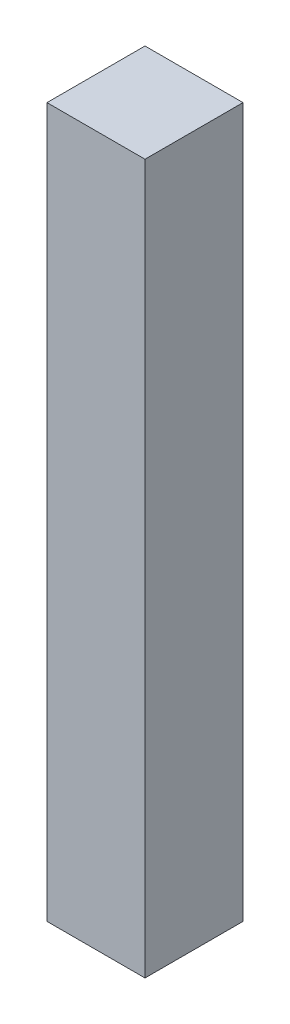
ISO-10303-21;
HEADER;
FILE_DESCRIPTION(('STEP AP214'),'2;1');
FILE_NAME('part.step','',(''),(''),'','','');
FILE_SCHEMA(('AUTOMOTIVE_DESIGN { 1 0 10303 214 1 1 1 1 }'));
ENDSEC;
DATA;
#1=APPLICATION_CONTEXT('core data for automotive mechanical design processes');
#2=APPLICATION_PROTOCOL_DEFINITION('international standard','automotive_design',2000,#1);
#3=PRODUCT_CONTEXT('',#1,'mechanical');
#4=PRODUCT('Part','Part','',(#3));
#5=PRODUCT_RELATED_PRODUCT_CATEGORY('part','',(#4));
#6=PRODUCT_DEFINITION_FORMATION('','',#4);
#7=PRODUCT_DEFINITION_CONTEXT('part definition',#1,'design');
#8=PRODUCT_DEFINITION('design','',#6,#7);
#9=PRODUCT_DEFINITION_SHAPE('','',#8);
#10=(LENGTH_UNIT() NAMED_UNIT(*) SI_UNIT(.MILLI.,.METRE.));
#11=(NAMED_UNIT(*) PLANE_ANGLE_UNIT() SI_UNIT($,.RADIAN.));
#12=(NAMED_UNIT(*) SI_UNIT($,.STERADIAN.) SOLID_ANGLE_UNIT());
#13=UNCERTAINTY_MEASURE_WITH_UNIT(LENGTH_MEASURE(1.E-05),#10,'distance_accuracy_value','');
#14=(GEOMETRIC_REPRESENTATION_CONTEXT(3) GLOBAL_UNCERTAINTY_ASSIGNED_CONTEXT((#13)) GLOBAL_UNIT_ASSIGNED_CONTEXT((#10,
#11,#12)) REPRESENTATION_CONTEXT('',''));
#15=CARTESIAN_POINT('',(0.,0.,0.));
#16=DIRECTION('',(0.,0.,1.));
#17=DIRECTION('',(1.,0.,0.));
#18=AXIS2_PLACEMENT_3D('',#15,#16,#17);
#19=CARTESIAN_POINT('',(-36.0550458715596,217.,-5.27064220183486));
#20=DIRECTION('',(1.,0.,0.));
#21=DIRECTION('',(0.,0.,-1.));
#22=AXIS2_PLACEMENT_3D('',#19,#20,#21);
#23=PLANE('',#22);
#24=DIRECTION('',(0.,0.,1.));
#25=VECTOR('',#24,1.);
#26=CARTESIAN_POINT('',(-36.0550458715596,0.,-5.27064220183486));
#27=LINE('',#26,#25);
#28=CARTESIAN_POINT('',(-36.0550458715596,0.,-5.27064220183486));
#29=VERTEX_POINT('',#28);
#30=CARTESIAN_POINT('',(-36.0550458715596,0.,24.7293577981651));
#31=VERTEX_POINT('',#30);
#32=EDGE_CURVE('E100',#29,#31,#27,.T.);
#33=ORIENTED_EDGE('',*,*,#32,.T.);
#34=DIRECTION('',(0.,-1.,0.));
#35=VECTOR('',#34,1.);
#36=CARTESIAN_POINT('',(-36.0550458715596,217.,24.7293577981651));
#37=LINE('',#36,#35);
#38=CARTESIAN_POINT('',(-36.0550458715596,217.,24.7293577981651));
#39=VERTEX_POINT('',#38);
#40=EDGE_CURVE('E11',#39,#31,#37,.T.);
#41=ORIENTED_EDGE('',*,*,#40,.F.);
#42=DIRECTION('',(0.,0.,1.));
#43=VECTOR('',#42,1.);
#44=CARTESIAN_POINT('',(-36.0550458715596,217.,-5.27064220183486));
#45=LINE('',#44,#43);
#46=CARTESIAN_POINT('',(-36.0550458715596,217.,-5.27064220183486));
#47=VERTEX_POINT('',#46);
#48=EDGE_CURVE('E88',#47,#39,#45,.T.);
#49=ORIENTED_EDGE('',*,*,#48,.F.);
#50=DIRECTION('',(0.,-1.,0.));
#51=VECTOR('',#50,1.);
#52=CARTESIAN_POINT('',(-36.0550458715596,217.,-5.27064220183486));
#53=LINE('',#52,#51);
#54=EDGE_CURVE('E96',#47,#29,#53,.T.);
#55=ORIENTED_EDGE('',*,*,#54,.T.);
#56=EDGE_LOOP('',(#33,#41,#49,#55));
#57=FACE_BOUND('',#56,.T.);
#58=ADVANCED_FACE('F37',(#57),#23,.F.);
#59=CARTESIAN_POINT('',(-36.0550458715596,217.,24.7293577981651));
#60=DIRECTION('',(0.,0.,-1.));
#61=DIRECTION('',(-1.,0.,0.));
#62=AXIS2_PLACEMENT_3D('',#59,#60,#61);
#63=PLANE('',#62);
#64=DIRECTION('',(1.,0.,0.));
#65=VECTOR('',#64,1.);
#66=CARTESIAN_POINT('',(-36.0550458715596,0.,24.7293577981651));
#67=LINE('',#66,#65);
#68=CARTESIAN_POINT('',(-6.05504587155963,0.,24.7293577981651));
#69=VERTEX_POINT('',#68);
#70=EDGE_CURVE('E92',#31,#69,#67,.T.);
#71=ORIENTED_EDGE('',*,*,#70,.T.);
#72=DIRECTION('',(0.,-1.,0.));
#73=VECTOR('',#72,1.);
#74=CARTESIAN_POINT('',(-6.05504587155963,217.,24.7293577981651));
#75=LINE('',#74,#73);
#76=CARTESIAN_POINT('',(-6.05504587155963,217.,24.7293577981651));
#77=VERTEX_POINT('',#76);
#78=EDGE_CURVE('E45',#77,#69,#75,.T.);
#79=ORIENTED_EDGE('',*,*,#78,.F.);
#80=DIRECTION('',(1.,0.,0.));
#81=VECTOR('',#80,1.);
#82=CARTESIAN_POINT('',(-36.0550458715596,217.,24.7293577981651));
#83=LINE('',#82,#81);
#84=EDGE_CURVE('E83',#39,#77,#83,.T.);
#85=ORIENTED_EDGE('',*,*,#84,.F.);
#86=ORIENTED_EDGE('',*,*,#40,.T.);
#87=EDGE_LOOP('',(#71,#79,#85,#86));
#88=FACE_BOUND('',#87,.T.);
#89=ADVANCED_FACE('F91',(#88),#63,.F.);
#90=CARTESIAN_POINT('',(-6.05504587155963,217.,-5.27064220183486));
#91=DIRECTION('',(-1.,0.,0.));
#92=DIRECTION('',(0.,0.,1.));
#93=AXIS2_PLACEMENT_3D('',#90,#91,#92);
#94=PLANE('',#93);
#95=DIRECTION('',(0.,0.,-1.));
#96=VECTOR('',#95,1.);
#97=CARTESIAN_POINT('',(-6.05504587155963,0.,-5.27064220183486));
#98=LINE('',#97,#96);
#99=CARTESIAN_POINT('',(-6.05504587155963,0.,-5.27064220183486));
#100=VERTEX_POINT('',#99);
#101=EDGE_CURVE('E70',#69,#100,#98,.T.);
#102=ORIENTED_EDGE('',*,*,#101,.T.);
#103=DIRECTION('',(0.,-1.,0.));
#104=VECTOR('',#103,1.);
#105=CARTESIAN_POINT('',(-6.05504587155963,217.,-5.27064220183486));
#106=LINE('',#105,#104);
#107=CARTESIAN_POINT('',(-6.05504587155963,217.,-5.27064220183486));
#108=VERTEX_POINT('',#107);
#109=EDGE_CURVE('E93',#108,#100,#106,.T.);
#110=ORIENTED_EDGE('',*,*,#109,.F.);
#111=DIRECTION('',(0.,0.,-1.));
#112=VECTOR('',#111,1.);
#113=CARTESIAN_POINT('',(-6.05504587155963,217.,-5.27064220183486));
#114=LINE('',#113,#112);
#115=EDGE_CURVE('E86',#77,#108,#114,.T.);
#116=ORIENTED_EDGE('',*,*,#115,.F.);
#117=ORIENTED_EDGE('',*,*,#78,.T.);
#118=EDGE_LOOP('',(#102,#110,#116,#117));
#119=FACE_BOUND('',#118,.T.);
#120=ADVANCED_FACE('F94',(#119),#94,.F.);
#121=CARTESIAN_POINT('',(-36.0550458715596,217.,-5.27064220183486));
#122=DIRECTION('',(0.,0.,1.));
#123=DIRECTION('',(1.,0.,0.));
#124=AXIS2_PLACEMENT_3D('',#121,#122,#123);
#125=PLANE('',#124);
#126=DIRECTION('',(-1.,0.,0.));
#127=VECTOR('',#126,1.);
#128=CARTESIAN_POINT('',(-36.0550458715596,0.,-5.27064220183486));
#129=LINE('',#128,#127);
#130=EDGE_CURVE('E76',#100,#29,#129,.T.);
#131=ORIENTED_EDGE('',*,*,#130,.T.);
#132=ORIENTED_EDGE('',*,*,#54,.F.);
#133=DIRECTION('',(-1.,0.,0.));
#134=VECTOR('',#133,1.);
#135=CARTESIAN_POINT('',(-36.0550458715596,217.,-5.27064220183486));
#136=LINE('',#135,#134);
#137=EDGE_CURVE('E53',#108,#47,#136,.T.);
#138=ORIENTED_EDGE('',*,*,#137,.F.);
#139=ORIENTED_EDGE('',*,*,#109,.T.);
#140=EDGE_LOOP('',(#131,#132,#138,#139));
#141=FACE_BOUND('',#140,.T.);
#142=ADVANCED_FACE('F107',(#141),#125,.F.);
#143=CARTESIAN_POINT('',(0.,217.,0.));
#144=DIRECTION('',(0.,1.,0.));
#145=DIRECTION('',(0.,0.,1.));
#146=AXIS2_PLACEMENT_3D('',#143,#144,#145);
#147=PLANE('',#146);
#148=ORIENTED_EDGE('',*,*,#48,.T.);
#149=ORIENTED_EDGE('',*,*,#84,.T.);
#150=ORIENTED_EDGE('',*,*,#115,.T.);
#151=ORIENTED_EDGE('',*,*,#137,.T.);
#152=EDGE_LOOP('',(#148,#149,#150,#151));
#153=FACE_BOUND('',#152,.T.);
#154=ADVANCED_FACE('F84',(#153),#147,.T.);
#155=CARTESIAN_POINT('',(0.,0.,0.));
#156=DIRECTION('',(0.,1.,0.));
#157=DIRECTION('',(0.,0.,1.));
#158=AXIS2_PLACEMENT_3D('',#155,#156,#157);
#159=PLANE('',#158);
#160=ORIENTED_EDGE('',*,*,#32,.F.);
#161=ORIENTED_EDGE('',*,*,#130,.F.);
#162=ORIENTED_EDGE('',*,*,#101,.F.);
#163=ORIENTED_EDGE('',*,*,#70,.F.);
#164=EDGE_LOOP('',(#160,#161,#162,#163));
#165=FACE_BOUND('',#164,.T.);
#166=ADVANCED_FACE('F110',(#165),#159,.F.);
#167=CLOSED_SHELL('',(#58,#89,#120,#142,#154,#166));
#168=MANIFOLD_SOLID_BREP('B2',#167);
#169=ADVANCED_BREP_SHAPE_REPRESENTATION('',(#18,#168),#14);
#170=SHAPE_DEFINITION_REPRESENTATION(#9,#169);
ENDSEC;
END-ISO-10303-21;
